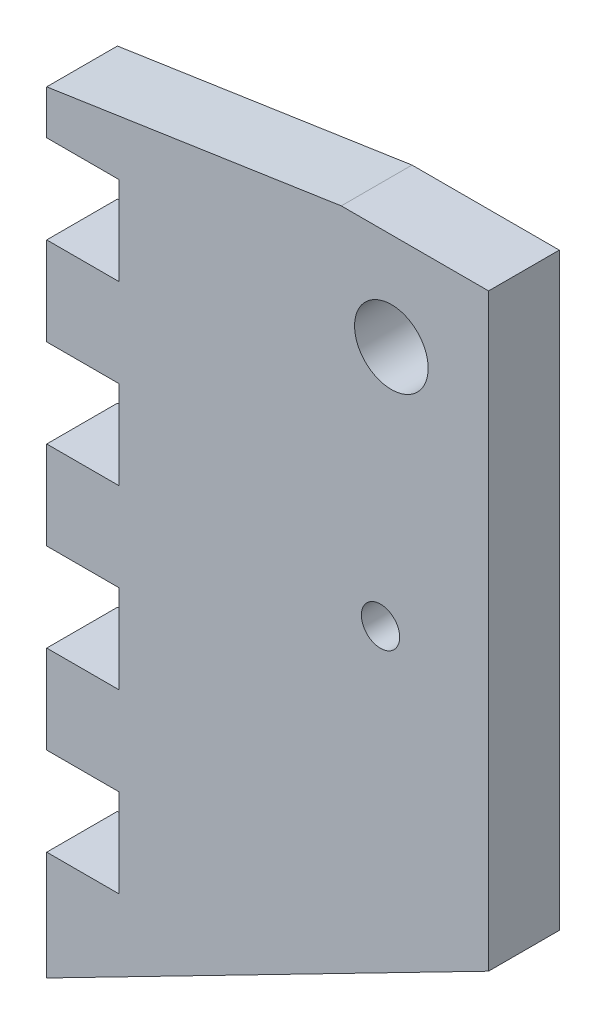
ISO-10303-21;
HEADER;
FILE_DESCRIPTION(('STEP AP214'),'2;1');
FILE_NAME('part.step','',(''),(''),'','','');
FILE_SCHEMA(('AUTOMOTIVE_DESIGN { 1 0 10303 214 1 1 1 1 }'));
ENDSEC;
DATA;
#1=APPLICATION_CONTEXT('core data for automotive mechanical design processes');
#2=APPLICATION_PROTOCOL_DEFINITION('international standard','automotive_design',2000,#1);
#3=PRODUCT_CONTEXT('',#1,'mechanical');
#4=PRODUCT('Part','Part','',(#3));
#5=PRODUCT_RELATED_PRODUCT_CATEGORY('part','',(#4));
#6=PRODUCT_DEFINITION_FORMATION('','',#4);
#7=PRODUCT_DEFINITION_CONTEXT('part definition',#1,'design');
#8=PRODUCT_DEFINITION('design','',#6,#7);
#9=PRODUCT_DEFINITION_SHAPE('','',#8);
#10=(LENGTH_UNIT() NAMED_UNIT(*) SI_UNIT(.MILLI.,.METRE.));
#11=(NAMED_UNIT(*) PLANE_ANGLE_UNIT() SI_UNIT($,.RADIAN.));
#12=(NAMED_UNIT(*) SI_UNIT($,.STERADIAN.) SOLID_ANGLE_UNIT());
#13=UNCERTAINTY_MEASURE_WITH_UNIT(LENGTH_MEASURE(1.E-05),#10,'distance_accuracy_value','');
#14=(GEOMETRIC_REPRESENTATION_CONTEXT(3) GLOBAL_UNCERTAINTY_ASSIGNED_CONTEXT((#13)) GLOBAL_UNIT_ASSIGNED_CONTEXT((#10,
#11,#12)) REPRESENTATION_CONTEXT('',''));
#15=CARTESIAN_POINT('',(0.,0.,0.));
#16=DIRECTION('',(0.,0.,1.));
#17=DIRECTION('',(1.,0.,0.));
#18=AXIS2_PLACEMENT_3D('',#15,#16,#17);
#19=CARTESIAN_POINT('',(-38.1,0.,6.096));
#20=DIRECTION('',(1.,0.,0.));
#21=DIRECTION('',(0.,0.,-1.));
#22=AXIS2_PLACEMENT_3D('',#19,#20,#21);
#23=PLANE('',#22);
#24=DIRECTION('',(0.,0.,1.));
#25=VECTOR('',#24,1.);
#26=CARTESIAN_POINT('',(-38.1,-60.96,0.));
#27=LINE('',#26,#25);
#28=CARTESIAN_POINT('',(-38.1,-60.96,0.));
#29=VERTEX_POINT('',#28);
#30=CARTESIAN_POINT('',(-38.1,-60.96,6.096));
#31=VERTEX_POINT('',#30);
#32=EDGE_CURVE('E219',#29,#31,#27,.T.);
#33=ORIENTED_EDGE('',*,*,#32,.F.);
#34=DIRECTION('',(0.,-1.,0.));
#35=VECTOR('',#34,1.);
#36=CARTESIAN_POINT('',(-38.1,0.,0.));
#37=LINE('',#36,#35);
#38=CARTESIAN_POINT('',(-38.1,-70.358,0.));
#39=VERTEX_POINT('',#38);
#40=EDGE_CURVE('E206',#29,#39,#37,.T.);
#41=ORIENTED_EDGE('',*,*,#40,.T.);
#42=DIRECTION('',(0.,0.,-1.));
#43=VECTOR('',#42,1.);
#44=CARTESIAN_POINT('',(-38.1,-70.358,6.096));
#45=LINE('',#44,#43);
#46=CARTESIAN_POINT('',(-38.1,-70.358,6.096));
#47=VERTEX_POINT('',#46);
#48=EDGE_CURVE('E11',#47,#39,#45,.T.);
#49=ORIENTED_EDGE('',*,*,#48,.F.);
#50=DIRECTION('',(0.,-1.,0.));
#51=VECTOR('',#50,1.);
#52=CARTESIAN_POINT('',(-38.1,0.,6.096));
#53=LINE('',#52,#51);
#54=EDGE_CURVE('E237',#31,#47,#53,.T.);
#55=ORIENTED_EDGE('',*,*,#54,.F.);
#56=EDGE_LOOP('',(#33,#41,#49,#55));
#57=FACE_BOUND('',#56,.T.);
#58=ADVANCED_FACE('F44',(#57),#23,.F.);
#59=DIRECTION('',(0.,0.,1.));
#60=VECTOR('',#59,1.);
#61=CARTESIAN_POINT('',(-38.1,-53.34,0.));
#62=LINE('',#61,#60);
#63=CARTESIAN_POINT('',(-38.1,-53.34,0.));
#64=VERTEX_POINT('',#63);
#65=CARTESIAN_POINT('',(-38.1,-53.34,6.096));
#66=VERTEX_POINT('',#65);
#67=EDGE_CURVE('E222',#64,#66,#62,.T.);
#68=ORIENTED_EDGE('',*,*,#67,.T.);
#69=CARTESIAN_POINT('',(-38.1,-45.72,6.096));
#70=VERTEX_POINT('',#69);
#71=EDGE_CURVE('E239',#70,#66,#53,.T.);
#72=ORIENTED_EDGE('',*,*,#71,.F.);
#73=DIRECTION('',(0.,0.,-1.));
#74=VECTOR('',#73,1.);
#75=CARTESIAN_POINT('',(-38.1,-45.72,6.096));
#76=LINE('',#75,#74);
#77=CARTESIAN_POINT('',(-38.1,-45.72,0.));
#78=VERTEX_POINT('',#77);
#79=EDGE_CURVE('E274',#70,#78,#76,.T.);
#80=ORIENTED_EDGE('',*,*,#79,.T.);
#81=EDGE_CURVE('E277',#78,#64,#37,.T.);
#82=ORIENTED_EDGE('',*,*,#81,.T.);
#83=EDGE_LOOP('',(#68,#72,#80,#82));
#84=FACE_BOUND('',#83,.T.);
#85=ADVANCED_FACE('F371',(#84),#23,.F.);
#86=CARTESIAN_POINT('',(0.,0.,6.096));
#87=DIRECTION('',(0.,0.,1.));
#88=DIRECTION('',(1.,0.,0.));
#89=AXIS2_PLACEMENT_3D('',#86,#87,#88);
#90=PLANE('',#89);
#91=CARTESIAN_POINT('',(-9.31898770115429,-29.6974157840725,6.096));
#92=DIRECTION('',(0.,0.,1.));
#93=DIRECTION('',(1.,0.,0.));
#94=AXIS2_PLACEMENT_3D('',#91,#92,#93);
#95=CIRCLE('',#94,1.651);
#96=CARTESIAN_POINT('',(-7.66798770115429,-29.6974157840725,6.096));
#97=VERTEX_POINT('',#96);
#98=EDGE_CURVE('E213',#97,#97,#95,.F.);
#99=ORIENTED_EDGE('',*,*,#98,.T.);
#100=EDGE_LOOP('',(#99));
#101=FACE_BOUND('',#100,.T.);
#102=CARTESIAN_POINT('',(-8.382,-8.382,6.096));
#103=DIRECTION('',(0.,0.,1.));
#104=DIRECTION('',(1.,0.,0.));
#105=AXIS2_PLACEMENT_3D('',#102,#103,#104);
#106=CIRCLE('',#105,3.175);
#107=CARTESIAN_POINT('',(-11.557,-8.382,6.096));
#108=VERTEX_POINT('',#107);
#109=EDGE_CURVE('E234',#108,#108,#106,.T.);
#110=ORIENTED_EDGE('',*,*,#109,.F.);
#111=EDGE_LOOP('',(#110));
#112=FACE_BOUND('',#111,.T.);
#113=DIRECTION('',(0.,-1.,0.));
#114=VECTOR('',#113,1.);
#115=CARTESIAN_POINT('',(-31.877,0.,6.096));
#116=LINE('',#115,#114);
#117=CARTESIAN_POINT('',(-31.877,-53.34,6.096));
#118=VERTEX_POINT('',#117);
#119=CARTESIAN_POINT('',(-31.877,-60.96,6.096));
#120=VERTEX_POINT('',#119);
#121=EDGE_CURVE('E210',#118,#120,#116,.T.);
#122=ORIENTED_EDGE('',*,*,#121,.T.);
#123=DIRECTION('',(-1.,0.,0.));
#124=VECTOR('',#123,1.);
#125=CARTESIAN_POINT('',(0.,-60.96,6.096));
#126=LINE('',#125,#124);
#127=EDGE_CURVE('E200',#120,#31,#126,.T.);
#128=ORIENTED_EDGE('',*,*,#127,.T.);
#129=ORIENTED_EDGE('',*,*,#54,.T.);
#130=DIRECTION('',(0.889632145943001,0.456677834917407,0.));
#131=VECTOR('',#130,1.);
#132=CARTESIAN_POINT('',(20.6387843399346,-40.2054240388336,6.096));
#133=LINE('',#132,#131);
#134=CARTESIAN_POINT('',(0.,-50.8,6.096));
#135=VERTEX_POINT('',#134);
#136=EDGE_CURVE('E242',#47,#135,#133,.T.);
#137=ORIENTED_EDGE('',*,*,#136,.T.);
#138=DIRECTION('',(0.,-1.,0.));
#139=VECTOR('',#138,1.);
#140=CARTESIAN_POINT('',(0.,0.,6.096));
#141=LINE('',#140,#139);
#142=CARTESIAN_POINT('',(0.,0.,6.096));
#143=VERTEX_POINT('',#142);
#144=EDGE_CURVE('E244',#143,#135,#141,.T.);
#145=ORIENTED_EDGE('',*,*,#144,.F.);
#146=DIRECTION('',(-1.,0.,0.));
#147=VECTOR('',#146,1.);
#148=CARTESIAN_POINT('',(0.,0.,6.096));
#149=LINE('',#148,#147);
#150=CARTESIAN_POINT('',(-12.7,0.,6.096));
#151=VERTEX_POINT('',#150);
#152=EDGE_CURVE('E247',#143,#151,#149,.T.);
#153=ORIENTED_EDGE('',*,*,#152,.T.);
#154=DIRECTION('',(0.988936352868298,0.148340452930245,0.));
#155=VECTOR('',#154,1.);
#156=CARTESIAN_POINT('',(-0.279462102689486,1.86308068459657,6.096));
#157=LINE('',#156,#155);
#158=CARTESIAN_POINT('',(-38.1,-3.81,6.096));
#159=VERTEX_POINT('',#158);
#160=EDGE_CURVE('E230',#159,#151,#157,.T.);
#161=ORIENTED_EDGE('',*,*,#160,.F.);
#162=DIRECTION('',(0.,-1.,0.));
#163=VECTOR('',#162,1.);
#164=CARTESIAN_POINT('',(-38.1,0.,6.096));
#165=LINE('',#164,#163);
#166=CARTESIAN_POINT('',(-38.1,-7.62,6.096));
#167=VERTEX_POINT('',#166);
#168=EDGE_CURVE('E250',#159,#167,#165,.T.);
#169=ORIENTED_EDGE('',*,*,#168,.T.);
#170=DIRECTION('',(1.,0.,0.));
#171=VECTOR('',#170,1.);
#172=CARTESIAN_POINT('',(0.,-7.62,6.096));
#173=LINE('',#172,#171);
#174=CARTESIAN_POINT('',(-31.877,-7.62,6.096));
#175=VERTEX_POINT('',#174);
#176=EDGE_CURVE('E252',#167,#175,#173,.T.);
#177=ORIENTED_EDGE('',*,*,#176,.T.);
#178=DIRECTION('',(0.,-1.,0.));
#179=VECTOR('',#178,1.);
#180=CARTESIAN_POINT('',(-31.877,0.,6.096));
#181=LINE('',#180,#179);
#182=CARTESIAN_POINT('',(-31.877,-15.24,6.096));
#183=VERTEX_POINT('',#182);
#184=EDGE_CURVE('E254',#175,#183,#181,.T.);
#185=ORIENTED_EDGE('',*,*,#184,.T.);
#186=DIRECTION('',(-1.,0.,0.));
#187=VECTOR('',#186,1.);
#188=CARTESIAN_POINT('',(0.,-15.24,6.096));
#189=LINE('',#188,#187);
#190=CARTESIAN_POINT('',(-38.1,-15.24,6.096));
#191=VERTEX_POINT('',#190);
#192=EDGE_CURVE('E256',#183,#191,#189,.T.);
#193=ORIENTED_EDGE('',*,*,#192,.T.);
#194=DIRECTION('',(0.,-1.,0.));
#195=VECTOR('',#194,1.);
#196=CARTESIAN_POINT('',(-38.1,0.,6.096));
#197=LINE('',#196,#195);
#198=CARTESIAN_POINT('',(-38.1,-22.86,6.096));
#199=VERTEX_POINT('',#198);
#200=EDGE_CURVE('E258',#191,#199,#197,.T.);
#201=ORIENTED_EDGE('',*,*,#200,.T.);
#202=DIRECTION('',(1.,0.,0.));
#203=VECTOR('',#202,1.);
#204=CARTESIAN_POINT('',(0.,-22.86,6.096));
#205=LINE('',#204,#203);
#206=CARTESIAN_POINT('',(-31.877,-22.86,6.096));
#207=VERTEX_POINT('',#206);
#208=EDGE_CURVE('E260',#199,#207,#205,.T.);
#209=ORIENTED_EDGE('',*,*,#208,.T.);
#210=DIRECTION('',(0.,-1.,0.));
#211=VECTOR('',#210,1.);
#212=CARTESIAN_POINT('',(-31.877,0.,6.096));
#213=LINE('',#212,#211);
#214=CARTESIAN_POINT('',(-31.877,-30.48,6.096));
#215=VERTEX_POINT('',#214);
#216=EDGE_CURVE('E262',#207,#215,#213,.T.);
#217=ORIENTED_EDGE('',*,*,#216,.T.);
#218=DIRECTION('',(-1.,0.,0.));
#219=VECTOR('',#218,1.);
#220=CARTESIAN_POINT('',(0.,-30.48,6.096));
#221=LINE('',#220,#219);
#222=CARTESIAN_POINT('',(-38.1,-30.48,6.096));
#223=VERTEX_POINT('',#222);
#224=EDGE_CURVE('E264',#215,#223,#221,.T.);
#225=ORIENTED_EDGE('',*,*,#224,.T.);
#226=DIRECTION('',(0.,-1.,0.));
#227=VECTOR('',#226,1.);
#228=CARTESIAN_POINT('',(-38.1,0.,6.096));
#229=LINE('',#228,#227);
#230=CARTESIAN_POINT('',(-38.1,-38.1,6.096));
#231=VERTEX_POINT('',#230);
#232=EDGE_CURVE('E266',#223,#231,#229,.T.);
#233=ORIENTED_EDGE('',*,*,#232,.T.);
#234=DIRECTION('',(1.,0.,0.));
#235=VECTOR('',#234,1.);
#236=CARTESIAN_POINT('',(0.,-38.1,6.096));
#237=LINE('',#236,#235);
#238=CARTESIAN_POINT('',(-31.877,-38.1,6.096));
#239=VERTEX_POINT('',#238);
#240=EDGE_CURVE('E268',#231,#239,#237,.T.);
#241=ORIENTED_EDGE('',*,*,#240,.T.);
#242=DIRECTION('',(0.,-1.,0.));
#243=VECTOR('',#242,1.);
#244=CARTESIAN_POINT('',(-31.877,0.,6.096));
#245=LINE('',#244,#243);
#246=CARTESIAN_POINT('',(-31.877,-45.72,6.096));
#247=VERTEX_POINT('',#246);
#248=EDGE_CURVE('E270',#239,#247,#245,.T.);
#249=ORIENTED_EDGE('',*,*,#248,.T.);
#250=DIRECTION('',(-1.,0.,0.));
#251=VECTOR('',#250,1.);
#252=CARTESIAN_POINT('',(0.,-45.72,6.096));
#253=LINE('',#252,#251);
#254=EDGE_CURVE('E272',#247,#70,#253,.T.);
#255=ORIENTED_EDGE('',*,*,#254,.T.);
#256=ORIENTED_EDGE('',*,*,#71,.T.);
#257=DIRECTION('',(1.,0.,0.));
#258=VECTOR('',#257,1.);
#259=CARTESIAN_POINT('',(0.,-53.34,6.096));
#260=LINE('',#259,#258);
#261=EDGE_CURVE('E207',#66,#118,#260,.T.);
#262=ORIENTED_EDGE('',*,*,#261,.T.);
#263=EDGE_LOOP('',(#122,#128,#129,#137,#145,#153,#161,#169,#177,#185,#193,#201,#209,#217,#225,
#233,#241,#249,#255,#256,#262));
#264=FACE_BOUND('',#263,.T.);
#265=ADVANCED_FACE('F364',(#101,#112,#264),#90,.T.);
#266=CARTESIAN_POINT('',(0.,0.,0.));
#267=DIRECTION('',(0.,0.,1.));
#268=DIRECTION('',(1.,0.,0.));
#269=AXIS2_PLACEMENT_3D('',#266,#267,#268);
#270=PLANE('',#269);
#271=CARTESIAN_POINT('',(-9.31898770115429,-29.6974157840725,0.));
#272=DIRECTION('',(0.,0.,-1.));
#273=DIRECTION('',(-1.,0.,0.));
#274=AXIS2_PLACEMENT_3D('',#271,#272,#273);
#275=CIRCLE('',#274,1.651);
#276=CARTESIAN_POINT('',(-10.9699877011543,-29.6974157840725,0.));
#277=VERTEX_POINT('',#276);
#278=EDGE_CURVE('E676',#277,#277,#275,.T.);
#279=ORIENTED_EDGE('',*,*,#278,.F.);
#280=EDGE_LOOP('',(#279));
#281=FACE_BOUND('',#280,.T.);
#282=CARTESIAN_POINT('',(-8.382,-8.382,0.));
#283=DIRECTION('',(0.,0.,1.));
#284=DIRECTION('',(1.,0.,0.));
#285=AXIS2_PLACEMENT_3D('',#282,#283,#284);
#286=CIRCLE('',#285,3.175);
#287=CARTESIAN_POINT('',(-11.557,-8.382,0.));
#288=VERTEX_POINT('',#287);
#289=EDGE_CURVE('E233',#288,#288,#286,.T.);
#290=ORIENTED_EDGE('',*,*,#289,.T.);
#291=EDGE_LOOP('',(#290));
#292=FACE_BOUND('',#291,.T.);
#293=DIRECTION('',(-1.,0.,0.));
#294=VECTOR('',#293,1.);
#295=CARTESIAN_POINT('',(0.,-60.96,0.));
#296=LINE('',#295,#294);
#297=CARTESIAN_POINT('',(-31.877,-60.96,0.));
#298=VERTEX_POINT('',#297);
#299=EDGE_CURVE('E194',#298,#29,#296,.T.);
#300=ORIENTED_EDGE('',*,*,#299,.F.);
#301=DIRECTION('',(0.,-1.,0.));
#302=VECTOR('',#301,1.);
#303=CARTESIAN_POINT('',(-31.877,0.,0.));
#304=LINE('',#303,#302);
#305=CARTESIAN_POINT('',(-31.877,-53.34,0.));
#306=VERTEX_POINT('',#305);
#307=EDGE_CURVE('E185',#306,#298,#304,.T.);
#308=ORIENTED_EDGE('',*,*,#307,.F.);
#309=DIRECTION('',(1.,0.,0.));
#310=VECTOR('',#309,1.);
#311=CARTESIAN_POINT('',(0.,-53.34,0.));
#312=LINE('',#311,#310);
#313=EDGE_CURVE('E193',#64,#306,#312,.T.);
#314=ORIENTED_EDGE('',*,*,#313,.F.);
#315=ORIENTED_EDGE('',*,*,#81,.F.);
#316=DIRECTION('',(-1.,0.,0.));
#317=VECTOR('',#316,1.);
#318=CARTESIAN_POINT('',(0.,-45.72,0.));
#319=LINE('',#318,#317);
#320=CARTESIAN_POINT('',(-31.877,-45.72,0.));
#321=VERTEX_POINT('',#320);
#322=EDGE_CURVE('E238',#321,#78,#319,.T.);
#323=ORIENTED_EDGE('',*,*,#322,.F.);
#324=DIRECTION('',(0.,-1.,0.));
#325=VECTOR('',#324,1.);
#326=CARTESIAN_POINT('',(-31.877,0.,0.));
#327=LINE('',#326,#325);
#328=CARTESIAN_POINT('',(-31.877,-38.1,0.));
#329=VERTEX_POINT('',#328);
#330=EDGE_CURVE('E309',#329,#321,#327,.T.);
#331=ORIENTED_EDGE('',*,*,#330,.F.);
#332=DIRECTION('',(1.,0.,0.));
#333=VECTOR('',#332,1.);
#334=CARTESIAN_POINT('',(0.,-38.1,0.));
#335=LINE('',#334,#333);
#336=CARTESIAN_POINT('',(-38.1,-38.1,0.));
#337=VERTEX_POINT('',#336);
#338=EDGE_CURVE('E307',#337,#329,#335,.T.);
#339=ORIENTED_EDGE('',*,*,#338,.F.);
#340=DIRECTION('',(0.,-1.,0.));
#341=VECTOR('',#340,1.);
#342=CARTESIAN_POINT('',(-38.1,0.,0.));
#343=LINE('',#342,#341);
#344=CARTESIAN_POINT('',(-38.1,-30.48,0.));
#345=VERTEX_POINT('',#344);
#346=EDGE_CURVE('E305',#345,#337,#343,.T.);
#347=ORIENTED_EDGE('',*,*,#346,.F.);
#348=DIRECTION('',(-1.,0.,0.));
#349=VECTOR('',#348,1.);
#350=CARTESIAN_POINT('',(0.,-30.48,0.));
#351=LINE('',#350,#349);
#352=CARTESIAN_POINT('',(-31.877,-30.48,0.));
#353=VERTEX_POINT('',#352);
#354=EDGE_CURVE('E303',#353,#345,#351,.T.);
#355=ORIENTED_EDGE('',*,*,#354,.F.);
#356=DIRECTION('',(0.,-1.,0.));
#357=VECTOR('',#356,1.);
#358=CARTESIAN_POINT('',(-31.877,0.,0.));
#359=LINE('',#358,#357);
#360=CARTESIAN_POINT('',(-31.877,-22.86,0.));
#361=VERTEX_POINT('',#360);
#362=EDGE_CURVE('E301',#361,#353,#359,.T.);
#363=ORIENTED_EDGE('',*,*,#362,.F.);
#364=DIRECTION('',(1.,0.,0.));
#365=VECTOR('',#364,1.);
#366=CARTESIAN_POINT('',(0.,-22.86,0.));
#367=LINE('',#366,#365);
#368=CARTESIAN_POINT('',(-38.1,-22.86,0.));
#369=VERTEX_POINT('',#368);
#370=EDGE_CURVE('E299',#369,#361,#367,.T.);
#371=ORIENTED_EDGE('',*,*,#370,.F.);
#372=DIRECTION('',(0.,-1.,0.));
#373=VECTOR('',#372,1.);
#374=CARTESIAN_POINT('',(-38.1,0.,0.));
#375=LINE('',#374,#373);
#376=CARTESIAN_POINT('',(-38.1,-15.24,0.));
#377=VERTEX_POINT('',#376);
#378=EDGE_CURVE('E297',#377,#369,#375,.T.);
#379=ORIENTED_EDGE('',*,*,#378,.F.);
#380=DIRECTION('',(-1.,0.,0.));
#381=VECTOR('',#380,1.);
#382=CARTESIAN_POINT('',(0.,-15.24,0.));
#383=LINE('',#382,#381);
#384=CARTESIAN_POINT('',(-31.877,-15.24,0.));
#385=VERTEX_POINT('',#384);
#386=EDGE_CURVE('E295',#385,#377,#383,.T.);
#387=ORIENTED_EDGE('',*,*,#386,.F.);
#388=DIRECTION('',(0.,-1.,0.));
#389=VECTOR('',#388,1.);
#390=CARTESIAN_POINT('',(-31.877,0.,0.));
#391=LINE('',#390,#389);
#392=CARTESIAN_POINT('',(-31.877,-7.62,0.));
#393=VERTEX_POINT('',#392);
#394=EDGE_CURVE('E293',#393,#385,#391,.T.);
#395=ORIENTED_EDGE('',*,*,#394,.F.);
#396=DIRECTION('',(1.,0.,0.));
#397=VECTOR('',#396,1.);
#398=CARTESIAN_POINT('',(0.,-7.62,0.));
#399=LINE('',#398,#397);
#400=CARTESIAN_POINT('',(-38.1,-7.62,0.));
#401=VERTEX_POINT('',#400);
#402=EDGE_CURVE('E291',#401,#393,#399,.T.);
#403=ORIENTED_EDGE('',*,*,#402,.F.);
#404=DIRECTION('',(0.,-1.,0.));
#405=VECTOR('',#404,1.);
#406=CARTESIAN_POINT('',(-38.1,0.,0.));
#407=LINE('',#406,#405);
#408=CARTESIAN_POINT('',(-38.1,-3.81,0.));
#409=VERTEX_POINT('',#408);
#410=EDGE_CURVE('E289',#409,#401,#407,.T.);
#411=ORIENTED_EDGE('',*,*,#410,.F.);
#412=DIRECTION('',(-0.988936352868298,-0.148340452930245,0.));
#413=VECTOR('',#412,1.);
#414=CARTESIAN_POINT('',(-12.7,0.,0.));
#415=LINE('',#414,#413);
#416=CARTESIAN_POINT('',(-12.7,0.,0.));
#417=VERTEX_POINT('',#416);
#418=EDGE_CURVE('E221',#417,#409,#415,.T.);
#419=ORIENTED_EDGE('',*,*,#418,.F.);
#420=DIRECTION('',(-1.,0.,0.));
#421=VECTOR('',#420,1.);
#422=CARTESIAN_POINT('',(0.,0.,0.));
#423=LINE('',#422,#421);
#424=CARTESIAN_POINT('',(0.,0.,0.));
#425=VERTEX_POINT('',#424);
#426=EDGE_CURVE('E286',#425,#417,#423,.T.);
#427=ORIENTED_EDGE('',*,*,#426,.F.);
#428=DIRECTION('',(0.,-1.,0.));
#429=VECTOR('',#428,1.);
#430=CARTESIAN_POINT('',(0.,0.,0.));
#431=LINE('',#430,#429);
#432=CARTESIAN_POINT('',(0.,-50.8,0.));
#433=VERTEX_POINT('',#432);
#434=EDGE_CURVE('E283',#425,#433,#431,.T.);
#435=ORIENTED_EDGE('',*,*,#434,.T.);
#436=DIRECTION('',(0.889632145943001,0.456677834917407,0.));
#437=VECTOR('',#436,1.);
#438=CARTESIAN_POINT('',(20.6387843399346,-40.2054240388336,0.));
#439=LINE('',#438,#437);
#440=EDGE_CURVE('E280',#39,#433,#439,.T.);
#441=ORIENTED_EDGE('',*,*,#440,.F.);
#442=ORIENTED_EDGE('',*,*,#40,.F.);
#443=EDGE_LOOP('',(#300,#308,#314,#315,#323,#331,#339,#347,#355,#363,#371,#379,#387,#395,#403,
#411,#419,#427,#435,#441,#442));
#444=FACE_BOUND('',#443,.T.);
#445=ADVANCED_FACE('F204',(#281,#292,#444),#270,.F.);
#446=CARTESIAN_POINT('',(20.6387843399346,-40.2054240388336,6.096));
#447=DIRECTION('',(-0.456677834917407,0.889632145943001,0.));
#448=DIRECTION('',(-0.889632145943001,-0.456677834917407,0.));
#449=AXIS2_PLACEMENT_3D('',#446,#447,#448);
#450=PLANE('',#449);
#451=ORIENTED_EDGE('',*,*,#440,.T.);
#452=DIRECTION('',(0.,0.,-1.));
#453=VECTOR('',#452,1.);
#454=CARTESIAN_POINT('',(0.,-50.8,6.096));
#455=LINE('',#454,#453);
#456=EDGE_CURVE('E52',#135,#433,#455,.T.);
#457=ORIENTED_EDGE('',*,*,#456,.F.);
#458=ORIENTED_EDGE('',*,*,#136,.F.);
#459=ORIENTED_EDGE('',*,*,#48,.T.);
#460=EDGE_LOOP('',(#451,#457,#458,#459));
#461=FACE_BOUND('',#460,.T.);
#462=ADVANCED_FACE('F355',(#461),#450,.F.);
#463=CARTESIAN_POINT('',(0.,0.,6.096));
#464=DIRECTION('',(1.,0.,0.));
#465=DIRECTION('',(0.,1.,0.));
#466=AXIS2_PLACEMENT_3D('',#463,#464,#465);
#467=PLANE('',#466);
#468=ORIENTED_EDGE('',*,*,#434,.F.);
#469=DIRECTION('',(0.,0.,-1.));
#470=VECTOR('',#469,1.);
#471=CARTESIAN_POINT('',(0.,0.,6.096));
#472=LINE('',#471,#470);
#473=EDGE_CURVE('E347',#143,#425,#472,.T.);
#474=ORIENTED_EDGE('',*,*,#473,.F.);
#475=ORIENTED_EDGE('',*,*,#144,.T.);
#476=ORIENTED_EDGE('',*,*,#456,.T.);
#477=EDGE_LOOP('',(#468,#474,#475,#476));
#478=FACE_BOUND('',#477,.T.);
#479=ADVANCED_FACE('F351',(#478),#467,.T.);
#480=CARTESIAN_POINT('',(0.,0.,6.096));
#481=DIRECTION('',(0.,-1.,0.));
#482=DIRECTION('',(0.,0.,-1.));
#483=AXIS2_PLACEMENT_3D('',#480,#481,#482);
#484=PLANE('',#483);
#485=ORIENTED_EDGE('',*,*,#426,.T.);
#486=DIRECTION('',(0.,0.,-1.));
#487=VECTOR('',#486,1.);
#488=CARTESIAN_POINT('',(-12.7,0.,8.636));
#489=LINE('',#488,#487);
#490=EDGE_CURVE('E67',#151,#417,#489,.T.);
#491=ORIENTED_EDGE('',*,*,#490,.F.);
#492=ORIENTED_EDGE('',*,*,#152,.F.);
#493=ORIENTED_EDGE('',*,*,#473,.T.);
#494=EDGE_LOOP('',(#485,#491,#492,#493));
#495=FACE_BOUND('',#494,.T.);
#496=ADVANCED_FACE('F360',(#495),#484,.F.);
#497=CARTESIAN_POINT('',(-38.1,0.,6.096));
#498=DIRECTION('',(1.,0.,0.));
#499=DIRECTION('',(0.,0.,-1.));
#500=AXIS2_PLACEMENT_3D('',#497,#498,#499);
#501=PLANE('',#500);
#502=ORIENTED_EDGE('',*,*,#168,.F.);
#503=DIRECTION('',(0.,0.,-1.));
#504=VECTOR('',#503,1.);
#505=CARTESIAN_POINT('',(-38.1,-3.81,8.636));
#506=LINE('',#505,#504);
#507=EDGE_CURVE('E227',#159,#409,#506,.T.);
#508=ORIENTED_EDGE('',*,*,#507,.T.);
#509=ORIENTED_EDGE('',*,*,#410,.T.);
#510=DIRECTION('',(0.,0.,-1.));
#511=VECTOR('',#510,1.);
#512=CARTESIAN_POINT('',(-38.1,-7.62,6.096));
#513=LINE('',#512,#511);
#514=EDGE_CURVE('E344',#167,#401,#513,.T.);
#515=ORIENTED_EDGE('',*,*,#514,.F.);
#516=EDGE_LOOP('',(#502,#508,#509,#515));
#517=FACE_BOUND('',#516,.T.);
#518=ADVANCED_FACE('F431',(#517),#501,.F.);
#519=CARTESIAN_POINT('',(0.,-7.62,6.096));
#520=DIRECTION('',(0.,1.,0.));
#521=DIRECTION('',(0.,0.,1.));
#522=AXIS2_PLACEMENT_3D('',#519,#520,#521);
#523=PLANE('',#522);
#524=ORIENTED_EDGE('',*,*,#402,.T.);
#525=DIRECTION('',(0.,0.,-1.));
#526=VECTOR('',#525,1.);
#527=CARTESIAN_POINT('',(-31.877,-7.62,6.096));
#528=LINE('',#527,#526);
#529=EDGE_CURVE('E341',#175,#393,#528,.T.);
#530=ORIENTED_EDGE('',*,*,#529,.F.);
#531=ORIENTED_EDGE('',*,*,#176,.F.);
#532=ORIENTED_EDGE('',*,*,#514,.T.);
#533=EDGE_LOOP('',(#524,#530,#531,#532));
#534=FACE_BOUND('',#533,.T.);
#535=ADVANCED_FACE('F427',(#534),#523,.F.);
#536=CARTESIAN_POINT('',(-31.877,0.,6.096));
#537=DIRECTION('',(1.,0.,0.));
#538=DIRECTION('',(0.,0.,-1.));
#539=AXIS2_PLACEMENT_3D('',#536,#537,#538);
#540=PLANE('',#539);
#541=ORIENTED_EDGE('',*,*,#394,.T.);
#542=DIRECTION('',(0.,0.,-1.));
#543=VECTOR('',#542,1.);
#544=CARTESIAN_POINT('',(-31.877,-15.24,6.096));
#545=LINE('',#544,#543);
#546=EDGE_CURVE('E338',#183,#385,#545,.T.);
#547=ORIENTED_EDGE('',*,*,#546,.F.);
#548=ORIENTED_EDGE('',*,*,#184,.F.);
#549=ORIENTED_EDGE('',*,*,#529,.T.);
#550=EDGE_LOOP('',(#541,#547,#548,#549));
#551=FACE_BOUND('',#550,.T.);
#552=ADVANCED_FACE('F422',(#551),#540,.F.);
#553=CARTESIAN_POINT('',(0.,-15.24,6.096));
#554=DIRECTION('',(0.,-1.,0.));
#555=DIRECTION('',(0.,0.,-1.));
#556=AXIS2_PLACEMENT_3D('',#553,#554,#555);
#557=PLANE('',#556);
#558=ORIENTED_EDGE('',*,*,#386,.T.);
#559=DIRECTION('',(0.,0.,-1.));
#560=VECTOR('',#559,1.);
#561=CARTESIAN_POINT('',(-38.1,-15.24,6.096));
#562=LINE('',#561,#560);
#563=EDGE_CURVE('E335',#191,#377,#562,.T.);
#564=ORIENTED_EDGE('',*,*,#563,.F.);
#565=ORIENTED_EDGE('',*,*,#192,.F.);
#566=ORIENTED_EDGE('',*,*,#546,.T.);
#567=EDGE_LOOP('',(#558,#564,#565,#566));
#568=FACE_BOUND('',#567,.T.);
#569=ADVANCED_FACE('F417',(#568),#557,.F.);
#570=CARTESIAN_POINT('',(-38.1,0.,6.096));
#571=DIRECTION('',(1.,0.,0.));
#572=DIRECTION('',(0.,0.,-1.));
#573=AXIS2_PLACEMENT_3D('',#570,#571,#572);
#574=PLANE('',#573);
#575=ORIENTED_EDGE('',*,*,#378,.T.);
#576=DIRECTION('',(0.,0.,-1.));
#577=VECTOR('',#576,1.);
#578=CARTESIAN_POINT('',(-38.1,-22.86,6.096));
#579=LINE('',#578,#577);
#580=EDGE_CURVE('E332',#199,#369,#579,.T.);
#581=ORIENTED_EDGE('',*,*,#580,.F.);
#582=ORIENTED_EDGE('',*,*,#200,.F.);
#583=ORIENTED_EDGE('',*,*,#563,.T.);
#584=EDGE_LOOP('',(#575,#581,#582,#583));
#585=FACE_BOUND('',#584,.T.);
#586=ADVANCED_FACE('F413',(#585),#574,.F.);
#587=CARTESIAN_POINT('',(0.,-22.86,6.096));
#588=DIRECTION('',(0.,1.,0.));
#589=DIRECTION('',(0.,0.,1.));
#590=AXIS2_PLACEMENT_3D('',#587,#588,#589);
#591=PLANE('',#590);
#592=ORIENTED_EDGE('',*,*,#370,.T.);
#593=DIRECTION('',(0.,0.,-1.));
#594=VECTOR('',#593,1.);
#595=CARTESIAN_POINT('',(-31.877,-22.86,6.096));
#596=LINE('',#595,#594);
#597=EDGE_CURVE('E329',#207,#361,#596,.T.);
#598=ORIENTED_EDGE('',*,*,#597,.F.);
#599=ORIENTED_EDGE('',*,*,#208,.F.);
#600=ORIENTED_EDGE('',*,*,#580,.T.);
#601=EDGE_LOOP('',(#592,#598,#599,#600));
#602=FACE_BOUND('',#601,.T.);
#603=ADVANCED_FACE('F408',(#602),#591,.F.);
#604=CARTESIAN_POINT('',(-31.877,0.,6.096));
#605=DIRECTION('',(1.,0.,0.));
#606=DIRECTION('',(0.,0.,-1.));
#607=AXIS2_PLACEMENT_3D('',#604,#605,#606);
#608=PLANE('',#607);
#609=ORIENTED_EDGE('',*,*,#362,.T.);
#610=DIRECTION('',(0.,0.,-1.));
#611=VECTOR('',#610,1.);
#612=CARTESIAN_POINT('',(-31.877,-30.48,6.096));
#613=LINE('',#612,#611);
#614=EDGE_CURVE('E326',#215,#353,#613,.T.);
#615=ORIENTED_EDGE('',*,*,#614,.F.);
#616=ORIENTED_EDGE('',*,*,#216,.F.);
#617=ORIENTED_EDGE('',*,*,#597,.T.);
#618=EDGE_LOOP('',(#609,#615,#616,#617));
#619=FACE_BOUND('',#618,.T.);
#620=ADVANCED_FACE('F402',(#619),#608,.F.);
#621=CARTESIAN_POINT('',(0.,-30.48,6.096));
#622=DIRECTION('',(0.,-1.,0.));
#623=DIRECTION('',(0.,0.,-1.));
#624=AXIS2_PLACEMENT_3D('',#621,#622,#623);
#625=PLANE('',#624);
#626=ORIENTED_EDGE('',*,*,#354,.T.);
#627=DIRECTION('',(0.,0.,-1.));
#628=VECTOR('',#627,1.);
#629=CARTESIAN_POINT('',(-38.1,-30.48,6.096));
#630=LINE('',#629,#628);
#631=EDGE_CURVE('E323',#223,#345,#630,.T.);
#632=ORIENTED_EDGE('',*,*,#631,.F.);
#633=ORIENTED_EDGE('',*,*,#224,.F.);
#634=ORIENTED_EDGE('',*,*,#614,.T.);
#635=EDGE_LOOP('',(#626,#632,#633,#634));
#636=FACE_BOUND('',#635,.T.);
#637=ADVANCED_FACE('F398',(#636),#625,.F.);
#638=CARTESIAN_POINT('',(-38.1,0.,6.096));
#639=DIRECTION('',(1.,0.,0.));
#640=DIRECTION('',(0.,0.,-1.));
#641=AXIS2_PLACEMENT_3D('',#638,#639,#640);
#642=PLANE('',#641);
#643=ORIENTED_EDGE('',*,*,#346,.T.);
#644=DIRECTION('',(0.,0.,-1.));
#645=VECTOR('',#644,1.);
#646=CARTESIAN_POINT('',(-38.1,-38.1,6.096));
#647=LINE('',#646,#645);
#648=EDGE_CURVE('E320',#231,#337,#647,.T.);
#649=ORIENTED_EDGE('',*,*,#648,.F.);
#650=ORIENTED_EDGE('',*,*,#232,.F.);
#651=ORIENTED_EDGE('',*,*,#631,.T.);
#652=EDGE_LOOP('',(#643,#649,#650,#651));
#653=FACE_BOUND('',#652,.T.);
#654=ADVANCED_FACE('F393',(#653),#642,.F.);
#655=CARTESIAN_POINT('',(0.,-38.1,6.096));
#656=DIRECTION('',(0.,1.,0.));
#657=DIRECTION('',(0.,0.,1.));
#658=AXIS2_PLACEMENT_3D('',#655,#656,#657);
#659=PLANE('',#658);
#660=ORIENTED_EDGE('',*,*,#338,.T.);
#661=DIRECTION('',(0.,0.,-1.));
#662=VECTOR('',#661,1.);
#663=CARTESIAN_POINT('',(-31.877,-38.1,6.096));
#664=LINE('',#663,#662);
#665=EDGE_CURVE('E317',#239,#329,#664,.T.);
#666=ORIENTED_EDGE('',*,*,#665,.F.);
#667=ORIENTED_EDGE('',*,*,#240,.F.);
#668=ORIENTED_EDGE('',*,*,#648,.T.);
#669=EDGE_LOOP('',(#660,#666,#667,#668));
#670=FACE_BOUND('',#669,.T.);
#671=ADVANCED_FACE('F387',(#670),#659,.F.);
#672=CARTESIAN_POINT('',(-31.877,0.,6.096));
#673=DIRECTION('',(1.,0.,0.));
#674=DIRECTION('',(0.,0.,-1.));
#675=AXIS2_PLACEMENT_3D('',#672,#673,#674);
#676=PLANE('',#675);
#677=ORIENTED_EDGE('',*,*,#330,.T.);
#678=DIRECTION('',(0.,0.,-1.));
#679=VECTOR('',#678,1.);
#680=CARTESIAN_POINT('',(-31.877,-45.72,6.096));
#681=LINE('',#680,#679);
#682=EDGE_CURVE('E314',#247,#321,#681,.T.);
#683=ORIENTED_EDGE('',*,*,#682,.F.);
#684=ORIENTED_EDGE('',*,*,#248,.F.);
#685=ORIENTED_EDGE('',*,*,#665,.T.);
#686=EDGE_LOOP('',(#677,#683,#684,#685));
#687=FACE_BOUND('',#686,.T.);
#688=ADVANCED_FACE('F383',(#687),#676,.F.);
#689=CARTESIAN_POINT('',(-8.382,-8.382,6.096));
#690=DIRECTION('',(0.,0.,-1.));
#691=DIRECTION('',(-1.,0.,0.));
#692=AXIS2_PLACEMENT_3D('',#689,#690,#691);
#693=CYLINDRICAL_SURFACE('',#692,3.175);
#694=CARTESIAN_POINT('',(-11.557,-8.382,6.096));
#695=CARTESIAN_POINT('',(-11.557,-8.382,6.0325));
#696=CARTESIAN_POINT('',(-11.557,-8.382,5.969));
#697=CARTESIAN_POINT('',(-11.557,-8.382,5.842));
#698=CARTESIAN_POINT('',(-11.557,-8.382,5.7785));
#699=CARTESIAN_POINT('',(-11.557,-8.382,5.6515));
#700=CARTESIAN_POINT('',(-11.557,-8.382,5.588));
#701=CARTESIAN_POINT('',(-11.557,-8.382,5.461));
#702=CARTESIAN_POINT('',(-11.557,-8.382,5.3975));
#703=CARTESIAN_POINT('',(-11.557,-8.382,5.2705));
#704=CARTESIAN_POINT('',(-11.557,-8.382,5.207));
#705=CARTESIAN_POINT('',(-11.557,-8.382,5.08));
#706=CARTESIAN_POINT('',(-11.557,-8.382,5.0165));
#707=CARTESIAN_POINT('',(-11.557,-8.382,4.8895));
#708=CARTESIAN_POINT('',(-11.557,-8.382,4.826));
#709=CARTESIAN_POINT('',(-11.557,-8.382,4.699));
#710=CARTESIAN_POINT('',(-11.557,-8.382,4.6355));
#711=CARTESIAN_POINT('',(-11.557,-8.382,4.5085));
#712=CARTESIAN_POINT('',(-11.557,-8.382,4.445));
#713=CARTESIAN_POINT('',(-11.557,-8.382,4.318));
#714=CARTESIAN_POINT('',(-11.557,-8.382,4.2545));
#715=CARTESIAN_POINT('',(-11.557,-8.382,4.1275));
#716=CARTESIAN_POINT('',(-11.557,-8.382,4.064));
#717=CARTESIAN_POINT('',(-11.557,-8.382,3.937));
#718=CARTESIAN_POINT('',(-11.557,-8.382,3.8735));
#719=CARTESIAN_POINT('',(-11.557,-8.382,3.7465));
#720=CARTESIAN_POINT('',(-11.557,-8.382,3.683));
#721=CARTESIAN_POINT('',(-11.557,-8.382,3.556));
#722=CARTESIAN_POINT('',(-11.557,-8.382,3.4925));
#723=CARTESIAN_POINT('',(-11.557,-8.382,3.3655));
#724=CARTESIAN_POINT('',(-11.557,-8.382,3.302));
#725=CARTESIAN_POINT('',(-11.557,-8.382,3.175));
#726=CARTESIAN_POINT('',(-11.557,-8.382,3.1115));
#727=CARTESIAN_POINT('',(-11.557,-8.382,2.9845));
#728=CARTESIAN_POINT('',(-11.557,-8.382,2.921));
#729=CARTESIAN_POINT('',(-11.557,-8.382,2.794));
#730=CARTESIAN_POINT('',(-11.557,-8.382,2.7305));
#731=CARTESIAN_POINT('',(-11.557,-8.382,2.6035));
#732=CARTESIAN_POINT('',(-11.557,-8.382,2.54));
#733=CARTESIAN_POINT('',(-11.557,-8.382,2.413));
#734=CARTESIAN_POINT('',(-11.557,-8.382,2.3495));
#735=CARTESIAN_POINT('',(-11.557,-8.382,2.2225));
#736=CARTESIAN_POINT('',(-11.557,-8.382,2.159));
#737=CARTESIAN_POINT('',(-11.557,-8.382,2.032));
#738=CARTESIAN_POINT('',(-11.557,-8.382,1.9685));
#739=CARTESIAN_POINT('',(-11.557,-8.382,1.8415));
#740=CARTESIAN_POINT('',(-11.557,-8.382,1.778));
#741=CARTESIAN_POINT('',(-11.557,-8.382,1.651));
#742=CARTESIAN_POINT('',(-11.557,-8.382,1.5875));
#743=CARTESIAN_POINT('',(-11.557,-8.382,1.4605));
#744=CARTESIAN_POINT('',(-11.557,-8.382,1.397));
#745=CARTESIAN_POINT('',(-11.557,-8.382,1.27));
#746=CARTESIAN_POINT('',(-11.557,-8.382,1.2065));
#747=CARTESIAN_POINT('',(-11.557,-8.382,1.0795));
#748=CARTESIAN_POINT('',(-11.557,-8.382,1.016));
#749=CARTESIAN_POINT('',(-11.557,-8.382,0.889));
#750=CARTESIAN_POINT('',(-11.557,-8.382,0.8255));
#751=CARTESIAN_POINT('',(-11.557,-8.382,0.6985));
#752=CARTESIAN_POINT('',(-11.557,-8.382,0.635));
#753=CARTESIAN_POINT('',(-11.557,-8.382,0.508));
#754=CARTESIAN_POINT('',(-11.557,-8.382,0.4445));
#755=CARTESIAN_POINT('',(-11.557,-8.382,0.3175));
#756=CARTESIAN_POINT('',(-11.557,-8.382,0.254));
#757=CARTESIAN_POINT('',(-11.557,-8.382,0.127));
#758=CARTESIAN_POINT('',(-11.557,-8.382,0.0634999999999999));
#759=CARTESIAN_POINT('',(-11.557,-8.382,0.));
#760=B_SPLINE_CURVE_WITH_KNOTS('',3,(#694,#695,#696,#697,#698,#699,#700,#701,#702,#703,#704,
#705,#706,#707,#708,#709,#710,#711,#712,#713,#714,#715,#716,#717,#718,#719,#720,#721,#722,#723,
#724,#725,#726,#727,#728,#729,#730,#731,#732,#733,#734,#735,#736,#737,#738,#739,#740,#741,#742,
#743,#744,#745,#746,#747,#748,#749,#750,#751,#752,#753,#754,#755,#756,#757,#758,#759),
.UNSPECIFIED.,.F.,.F.,(4,2,2,2,2,2,2,2,2,2,2,2,2,2,2,2,2,2,2,2,2,2,2,2,2,2,2,2,2,2,2,2,4),(0.,
0.1905,0.380999999999999,0.571499999999999,0.762,0.952499999999999,1.143,1.3335,1.524,1.7145,
1.905,2.0955,2.286,2.4765,2.667,2.8575,3.048,3.2385,3.429,3.6195,3.81,4.0005,4.191,4.3815,4.572,
4.7625,4.953,5.1435,5.334,5.5245,5.715,5.9055,6.096),.UNSPECIFIED.);
#761=EDGE_CURVE('BSEAM46',#108,#288,#760,.T.);
#762=ORIENTED_EDGE('',*,*,#109,.T.);
#763=ORIENTED_EDGE('',*,*,#289,.F.);
#764=ORIENTED_EDGE('',*,*,#761,.T.);
#765=ORIENTED_EDGE('',*,*,#761,.F.);
#766=EDGE_LOOP('',(#762,#764,#763,#765));
#767=FACE_BOUND('',#766,.T.);
#768=ADVANCED_FACE('F46',(#767),#693,.F.);
#769=CARTESIAN_POINT('',(0.,-45.72,6.096));
#770=DIRECTION('',(0.,-1.,0.));
#771=DIRECTION('',(0.,0.,-1.));
#772=AXIS2_PLACEMENT_3D('',#769,#770,#771);
#773=PLANE('',#772);
#774=ORIENTED_EDGE('',*,*,#322,.T.);
#775=ORIENTED_EDGE('',*,*,#79,.F.);
#776=ORIENTED_EDGE('',*,*,#254,.F.);
#777=ORIENTED_EDGE('',*,*,#682,.T.);
#778=EDGE_LOOP('',(#774,#775,#776,#777));
#779=FACE_BOUND('',#778,.T.);
#780=ADVANCED_FACE('F378',(#779),#773,.F.);
#781=CARTESIAN_POINT('',(-12.7,0.,8.636));
#782=DIRECTION('',(0.148340452930245,-0.988936352868297,0.));
#783=DIRECTION('',(0.988936352868298,0.148340452930245,0.));
#784=AXIS2_PLACEMENT_3D('',#781,#782,#783);
#785=PLANE('',#784);
#786=ORIENTED_EDGE('',*,*,#160,.T.);
#787=ORIENTED_EDGE('',*,*,#490,.T.);
#788=ORIENTED_EDGE('',*,*,#418,.T.);
#789=ORIENTED_EDGE('',*,*,#507,.F.);
#790=EDGE_LOOP('',(#786,#787,#788,#789));
#791=FACE_BOUND('',#790,.T.);
#792=ADVANCED_FACE('F432',(#791),#785,.F.);
#793=CARTESIAN_POINT('',(0.,-60.96,0.));
#794=DIRECTION('',(0.,1.,0.));
#795=DIRECTION('',(0.,0.,1.));
#796=AXIS2_PLACEMENT_3D('',#793,#794,#795);
#797=PLANE('',#796);
#798=ORIENTED_EDGE('',*,*,#127,.F.);
#799=DIRECTION('',(0.,0.,1.));
#800=VECTOR('',#799,1.);
#801=CARTESIAN_POINT('',(-31.877,-60.96,0.));
#802=LINE('',#801,#800);
#803=EDGE_CURVE('E188',#298,#120,#802,.T.);
#804=ORIENTED_EDGE('',*,*,#803,.F.);
#805=ORIENTED_EDGE('',*,*,#299,.T.);
#806=ORIENTED_EDGE('',*,*,#32,.T.);
#807=EDGE_LOOP('',(#798,#804,#805,#806));
#808=FACE_BOUND('',#807,.T.);
#809=ADVANCED_FACE('F197',(#808),#797,.T.);
#810=CARTESIAN_POINT('',(0.,-53.34,0.));
#811=DIRECTION('',(0.,-1.,0.));
#812=DIRECTION('',(0.,0.,-1.));
#813=AXIS2_PLACEMENT_3D('',#810,#811,#812);
#814=PLANE('',#813);
#815=ORIENTED_EDGE('',*,*,#261,.F.);
#816=ORIENTED_EDGE('',*,*,#67,.F.);
#817=ORIENTED_EDGE('',*,*,#313,.T.);
#818=DIRECTION('',(0.,0.,1.));
#819=VECTOR('',#818,1.);
#820=CARTESIAN_POINT('',(-31.877,-53.34,0.));
#821=LINE('',#820,#819);
#822=EDGE_CURVE('E59',#306,#118,#821,.T.);
#823=ORIENTED_EDGE('',*,*,#822,.T.);
#824=EDGE_LOOP('',(#815,#816,#817,#823));
#825=FACE_BOUND('',#824,.T.);
#826=ADVANCED_FACE('F369',(#825),#814,.T.);
#827=CARTESIAN_POINT('',(-31.877,0.,0.));
#828=DIRECTION('',(-1.,0.,0.));
#829=DIRECTION('',(0.,0.,1.));
#830=AXIS2_PLACEMENT_3D('',#827,#828,#829);
#831=PLANE('',#830);
#832=ORIENTED_EDGE('',*,*,#121,.F.);
#833=ORIENTED_EDGE('',*,*,#822,.F.);
#834=ORIENTED_EDGE('',*,*,#307,.T.);
#835=ORIENTED_EDGE('',*,*,#803,.T.);
#836=EDGE_LOOP('',(#832,#833,#834,#835));
#837=FACE_BOUND('',#836,.T.);
#838=ADVANCED_FACE('F187',(#837),#831,.T.);
#839=CARTESIAN_POINT('',(-9.31898770115429,-29.6974157840725,10.765733182956));
#840=DIRECTION('',(0.,0.,-1.));
#841=DIRECTION('',(-1.,0.,0.));
#842=AXIS2_PLACEMENT_3D('',#839,#840,#841);
#843=CYLINDRICAL_SURFACE('',#842,1.651);
#844=ORIENTED_EDGE('',*,*,#278,.T.);
#845=EDGE_LOOP('',(#844));
#846=FACE_BOUND('',#845,.T.);
#847=ORIENTED_EDGE('',*,*,#98,.F.);
#848=EDGE_LOOP('',(#847));
#849=FACE_BOUND('',#848,.T.);
#850=ADVANCED_FACE('F513',(#846,#849),#843,.F.);
#851=CLOSED_SHELL('',(#58,#85,#265,#445,#462,#479,#496,#518,#535,#552,#569,#586,#603,#620,#637,
#654,#671,#688,#768,#780,#792,#809,#826,#838,#850));
#852=MANIFOLD_SOLID_BREP('B2',#851);
#853=ADVANCED_BREP_SHAPE_REPRESENTATION('',(#18,#852),#14);
#854=SHAPE_DEFINITION_REPRESENTATION(#9,#853);
ENDSEC;
END-ISO-10303-21;
